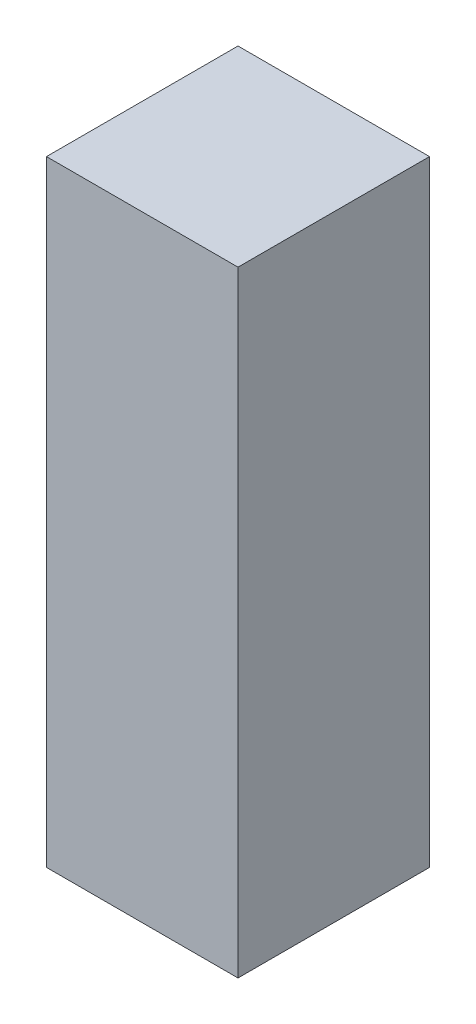
ISO-10303-21;
HEADER;
FILE_DESCRIPTION(('STEP AP214'),'2;1');
FILE_NAME('part.step','',(''),(''),'','','');
FILE_SCHEMA(('AUTOMOTIVE_DESIGN { 1 0 10303 214 1 1 1 1 }'));
ENDSEC;
DATA;
#1=APPLICATION_CONTEXT('core data for automotive mechanical design processes');
#2=APPLICATION_PROTOCOL_DEFINITION('international standard','automotive_design',2000,#1);
#3=PRODUCT_CONTEXT('',#1,'mechanical');
#4=PRODUCT('Part','Part','',(#3));
#5=PRODUCT_RELATED_PRODUCT_CATEGORY('part','',(#4));
#6=PRODUCT_DEFINITION_FORMATION('','',#4);
#7=PRODUCT_DEFINITION_CONTEXT('part definition',#1,'design');
#8=PRODUCT_DEFINITION('design','',#6,#7);
#9=PRODUCT_DEFINITION_SHAPE('','',#8);
#10=(LENGTH_UNIT() NAMED_UNIT(*) SI_UNIT(.MILLI.,.METRE.));
#11=(NAMED_UNIT(*) PLANE_ANGLE_UNIT() SI_UNIT($,.RADIAN.));
#12=(NAMED_UNIT(*) SI_UNIT($,.STERADIAN.) SOLID_ANGLE_UNIT());
#13=UNCERTAINTY_MEASURE_WITH_UNIT(LENGTH_MEASURE(1.E-05),#10,'distance_accuracy_value','');
#14=(GEOMETRIC_REPRESENTATION_CONTEXT(3) GLOBAL_UNCERTAINTY_ASSIGNED_CONTEXT((#13)) GLOBAL_UNIT_ASSIGNED_CONTEXT((#10,
#11,#12)) REPRESENTATION_CONTEXT('',''));
#15=CARTESIAN_POINT('',(0.,0.,0.));
#16=DIRECTION('',(0.,0.,1.));
#17=DIRECTION('',(1.,0.,0.));
#18=AXIS2_PLACEMENT_3D('',#15,#16,#17);
#19=CARTESIAN_POINT('',(-35.,225.,35.));
#20=DIRECTION('',(1.,0.,0.));
#21=DIRECTION('',(0.,0.,-1.));
#22=AXIS2_PLACEMENT_3D('',#19,#20,#21);
#23=PLANE('',#22);
#24=DIRECTION('',(0.,0.,1.));
#25=VECTOR('',#24,1.);
#26=CARTESIAN_POINT('',(-35.,0.,35.));
#27=LINE('',#26,#25);
#28=CARTESIAN_POINT('',(-35.,0.,-35.));
#29=VERTEX_POINT('',#28);
#30=CARTESIAN_POINT('',(-35.,0.,35.));
#31=VERTEX_POINT('',#30);
#32=EDGE_CURVE('E107',#29,#31,#27,.T.);
#33=ORIENTED_EDGE('',*,*,#32,.T.);
#34=DIRECTION('',(0.,-1.,0.));
#35=VECTOR('',#34,1.);
#36=CARTESIAN_POINT('',(-35.,225.,35.));
#37=LINE('',#36,#35);
#38=CARTESIAN_POINT('',(-35.,225.,35.));
#39=VERTEX_POINT('',#38);
#40=EDGE_CURVE('E11',#39,#31,#37,.T.);
#41=ORIENTED_EDGE('',*,*,#40,.F.);
#42=DIRECTION('',(0.,0.,1.));
#43=VECTOR('',#42,1.);
#44=CARTESIAN_POINT('',(-35.,225.,35.));
#45=LINE('',#44,#43);
#46=CARTESIAN_POINT('',(-35.,225.,-35.));
#47=VERTEX_POINT('',#46);
#48=EDGE_CURVE('E91',#47,#39,#45,.T.);
#49=ORIENTED_EDGE('',*,*,#48,.F.);
#50=DIRECTION('',(0.,-1.,0.));
#51=VECTOR('',#50,1.);
#52=CARTESIAN_POINT('',(-35.,225.,-35.));
#53=LINE('',#52,#51);
#54=EDGE_CURVE('E103',#47,#29,#53,.T.);
#55=ORIENTED_EDGE('',*,*,#54,.T.);
#56=EDGE_LOOP('',(#33,#41,#49,#55));
#57=FACE_BOUND('',#56,.T.);
#58=ADVANCED_FACE('F39',(#57),#23,.F.);
#59=CARTESIAN_POINT('',(35.,225.,35.));
#60=DIRECTION('',(0.,0.,-1.));
#61=DIRECTION('',(-1.,0.,0.));
#62=AXIS2_PLACEMENT_3D('',#59,#60,#61);
#63=PLANE('',#62);
#64=DIRECTION('',(1.,0.,0.));
#65=VECTOR('',#64,1.);
#66=CARTESIAN_POINT('',(35.,0.,35.));
#67=LINE('',#66,#65);
#68=CARTESIAN_POINT('',(35.,0.,35.));
#69=VERTEX_POINT('',#68);
#70=EDGE_CURVE('E96',#31,#69,#67,.T.);
#71=ORIENTED_EDGE('',*,*,#70,.T.);
#72=DIRECTION('',(0.,-1.,0.));
#73=VECTOR('',#72,1.);
#74=CARTESIAN_POINT('',(35.,225.,35.));
#75=LINE('',#74,#73);
#76=CARTESIAN_POINT('',(35.,225.,35.));
#77=VERTEX_POINT('',#76);
#78=EDGE_CURVE('E48',#77,#69,#75,.T.);
#79=ORIENTED_EDGE('',*,*,#78,.F.);
#80=DIRECTION('',(1.,0.,0.));
#81=VECTOR('',#80,1.);
#82=CARTESIAN_POINT('',(35.,225.,35.));
#83=LINE('',#82,#81);
#84=EDGE_CURVE('E86',#39,#77,#83,.T.);
#85=ORIENTED_EDGE('',*,*,#84,.F.);
#86=ORIENTED_EDGE('',*,*,#40,.T.);
#87=EDGE_LOOP('',(#71,#79,#85,#86));
#88=FACE_BOUND('',#87,.T.);
#89=ADVANCED_FACE('F95',(#88),#63,.F.);
#90=CARTESIAN_POINT('',(35.,225.,35.));
#91=DIRECTION('',(-1.,0.,0.));
#92=DIRECTION('',(0.,0.,1.));
#93=AXIS2_PLACEMENT_3D('',#90,#91,#92);
#94=PLANE('',#93);
#95=DIRECTION('',(0.,0.,-1.));
#96=VECTOR('',#95,1.);
#97=CARTESIAN_POINT('',(35.,0.,35.));
#98=LINE('',#97,#96);
#99=CARTESIAN_POINT('',(35.,0.,-35.));
#100=VERTEX_POINT('',#99);
#101=EDGE_CURVE('E73',#69,#100,#98,.T.);
#102=ORIENTED_EDGE('',*,*,#101,.T.);
#103=DIRECTION('',(0.,-1.,0.));
#104=VECTOR('',#103,1.);
#105=CARTESIAN_POINT('',(35.,225.,-35.));
#106=LINE('',#105,#104);
#107=CARTESIAN_POINT('',(35.,225.,-35.));
#108=VERTEX_POINT('',#107);
#109=EDGE_CURVE('E98',#108,#100,#106,.T.);
#110=ORIENTED_EDGE('',*,*,#109,.F.);
#111=DIRECTION('',(0.,0.,-1.));
#112=VECTOR('',#111,1.);
#113=CARTESIAN_POINT('',(35.,225.,35.));
#114=LINE('',#113,#112);
#115=EDGE_CURVE('E89',#77,#108,#114,.T.);
#116=ORIENTED_EDGE('',*,*,#115,.F.);
#117=ORIENTED_EDGE('',*,*,#78,.T.);
#118=EDGE_LOOP('',(#102,#110,#116,#117));
#119=FACE_BOUND('',#118,.T.);
#120=ADVANCED_FACE('F99',(#119),#94,.F.);
#121=CARTESIAN_POINT('',(35.,225.,-35.));
#122=DIRECTION('',(0.,0.,1.));
#123=DIRECTION('',(1.,0.,0.));
#124=AXIS2_PLACEMENT_3D('',#121,#122,#123);
#125=PLANE('',#124);
#126=DIRECTION('',(-1.,0.,0.));
#127=VECTOR('',#126,1.);
#128=CARTESIAN_POINT('',(35.,0.,-35.));
#129=LINE('',#128,#127);
#130=EDGE_CURVE('E79',#100,#29,#129,.T.);
#131=ORIENTED_EDGE('',*,*,#130,.T.);
#132=ORIENTED_EDGE('',*,*,#54,.F.);
#133=DIRECTION('',(-1.,0.,0.));
#134=VECTOR('',#133,1.);
#135=CARTESIAN_POINT('',(35.,225.,-35.));
#136=LINE('',#135,#134);
#137=EDGE_CURVE('E56',#108,#47,#136,.T.);
#138=ORIENTED_EDGE('',*,*,#137,.F.);
#139=ORIENTED_EDGE('',*,*,#109,.T.);
#140=EDGE_LOOP('',(#131,#132,#138,#139));
#141=FACE_BOUND('',#140,.T.);
#142=ADVANCED_FACE('F120',(#141),#125,.F.);
#143=CARTESIAN_POINT('',(0.,225.,0.));
#144=DIRECTION('',(0.,1.,0.));
#145=DIRECTION('',(0.,0.,1.));
#146=AXIS2_PLACEMENT_3D('',#143,#144,#145);
#147=PLANE('',#146);
#148=ORIENTED_EDGE('',*,*,#48,.T.);
#149=ORIENTED_EDGE('',*,*,#84,.T.);
#150=ORIENTED_EDGE('',*,*,#115,.T.);
#151=ORIENTED_EDGE('',*,*,#137,.T.);
#152=EDGE_LOOP('',(#148,#149,#150,#151));
#153=FACE_BOUND('',#152,.T.);
#154=ADVANCED_FACE('F87',(#153),#147,.T.);
#155=CARTESIAN_POINT('',(0.,0.,0.));
#156=DIRECTION('',(0.,1.,0.));
#157=DIRECTION('',(0.,0.,1.));
#158=AXIS2_PLACEMENT_3D('',#155,#156,#157);
#159=PLANE('',#158);
#160=ORIENTED_EDGE('',*,*,#32,.F.);
#161=ORIENTED_EDGE('',*,*,#130,.F.);
#162=ORIENTED_EDGE('',*,*,#101,.F.);
#163=ORIENTED_EDGE('',*,*,#70,.F.);
#164=EDGE_LOOP('',(#160,#161,#162,#163));
#165=FACE_BOUND('',#164,.T.);
#166=ADVANCED_FACE('F123',(#165),#159,.F.);
#167=CLOSED_SHELL('',(#58,#89,#120,#142,#154,#166));
#168=MANIFOLD_SOLID_BREP('B2',#167);
#169=ADVANCED_BREP_SHAPE_REPRESENTATION('',(#18,#168),#14);
#170=SHAPE_DEFINITION_REPRESENTATION(#9,#169);
ENDSEC;
END-ISO-10303-21;
